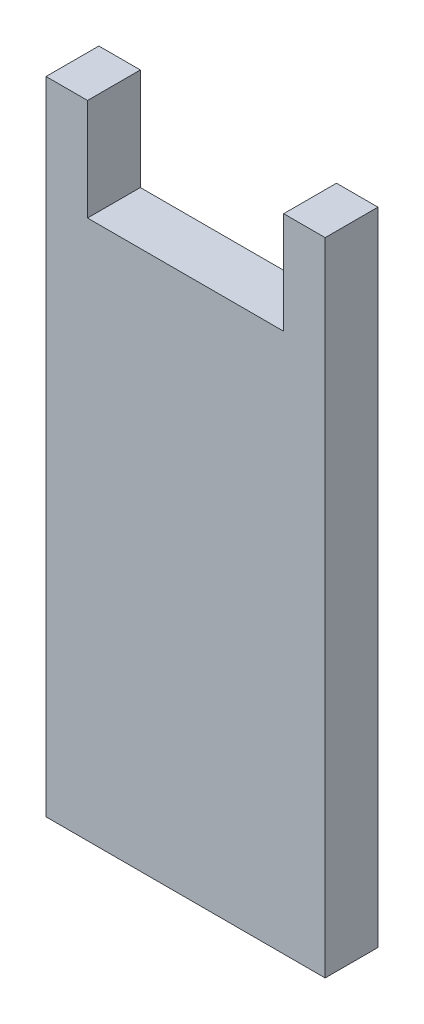
ISO-10303-21;
HEADER;
FILE_DESCRIPTION(('STEP AP214'),'2;1');
FILE_NAME('part.step','',(''),(''),'','','');
FILE_SCHEMA(('AUTOMOTIVE_DESIGN { 1 0 10303 214 1 1 1 1 }'));
ENDSEC;
DATA;
#1=APPLICATION_CONTEXT('core data for automotive mechanical design processes');
#2=APPLICATION_PROTOCOL_DEFINITION('international standard','automotive_design',2000,#1);
#3=PRODUCT_CONTEXT('',#1,'mechanical');
#4=PRODUCT('Part','Part','',(#3));
#5=PRODUCT_RELATED_PRODUCT_CATEGORY('part','',(#4));
#6=PRODUCT_DEFINITION_FORMATION('','',#4);
#7=PRODUCT_DEFINITION_CONTEXT('part definition',#1,'design');
#8=PRODUCT_DEFINITION('design','',#6,#7);
#9=PRODUCT_DEFINITION_SHAPE('','',#8);
#10=(LENGTH_UNIT() NAMED_UNIT(*) SI_UNIT(.MILLI.,.METRE.));
#11=(NAMED_UNIT(*) PLANE_ANGLE_UNIT() SI_UNIT($,.RADIAN.));
#12=(NAMED_UNIT(*) SI_UNIT($,.STERADIAN.) SOLID_ANGLE_UNIT());
#13=UNCERTAINTY_MEASURE_WITH_UNIT(LENGTH_MEASURE(1.E-05),#10,'distance_accuracy_value','');
#14=(GEOMETRIC_REPRESENTATION_CONTEXT(3) GLOBAL_UNCERTAINTY_ASSIGNED_CONTEXT((#13)) GLOBAL_UNIT_ASSIGNED_CONTEXT((#10,
#11,#12)) REPRESENTATION_CONTEXT('',''));
#15=CARTESIAN_POINT('',(0.,0.,0.));
#16=DIRECTION('',(0.,0.,1.));
#17=DIRECTION('',(1.,0.,0.));
#18=AXIS2_PLACEMENT_3D('',#15,#16,#17);
#19=CARTESIAN_POINT('',(20.,80.7608695652174,-7.));
#20=DIRECTION('',(1.,0.,0.));
#21=DIRECTION('',(0.,1.,0.));
#22=AXIS2_PLACEMENT_3D('',#19,#20,#21);
#23=PLANE('',#22);
#24=DIRECTION('',(0.,1.,0.));
#25=VECTOR('',#24,1.);
#26=CARTESIAN_POINT('',(20.,80.7608695652174,0.));
#27=LINE('',#26,#25);
#28=CARTESIAN_POINT('',(20.,-4.23913043478262,0.));
#29=VERTEX_POINT('',#28);
#30=CARTESIAN_POINT('',(20.,80.7608695652174,0.));
#31=VERTEX_POINT('',#30);
#32=EDGE_CURVE('E142',#29,#31,#27,.T.);
#33=ORIENTED_EDGE('',*,*,#32,.F.);
#34=DIRECTION('',(0.,0.,1.));
#35=VECTOR('',#34,1.);
#36=CARTESIAN_POINT('',(20.,-4.23913043478262,-7.));
#37=LINE('',#36,#35);
#38=CARTESIAN_POINT('',(20.,-4.23913043478262,-7.));
#39=VERTEX_POINT('',#38);
#40=EDGE_CURVE('E11',#39,#29,#37,.T.);
#41=ORIENTED_EDGE('',*,*,#40,.F.);
#42=DIRECTION('',(0.,1.,0.));
#43=VECTOR('',#42,1.);
#44=CARTESIAN_POINT('',(20.,80.7608695652174,-7.));
#45=LINE('',#44,#43);
#46=CARTESIAN_POINT('',(20.,80.7608695652174,-7.));
#47=VERTEX_POINT('',#46);
#48=EDGE_CURVE('E170',#39,#47,#45,.T.);
#49=ORIENTED_EDGE('',*,*,#48,.T.);
#50=DIRECTION('',(0.,0.,1.));
#51=VECTOR('',#50,1.);
#52=CARTESIAN_POINT('',(20.,80.7608695652174,-7.));
#53=LINE('',#52,#51);
#54=EDGE_CURVE('E42',#47,#31,#53,.T.);
#55=ORIENTED_EDGE('',*,*,#54,.T.);
#56=EDGE_LOOP('',(#33,#41,#49,#55));
#57=FACE_BOUND('',#56,.T.);
#58=ADVANCED_FACE('F39',(#57),#23,.T.);
#59=CARTESIAN_POINT('',(-17.,-4.23913043478262,-7.));
#60=DIRECTION('',(0.,-1.,0.));
#61=DIRECTION('',(0.,0.,-1.));
#62=AXIS2_PLACEMENT_3D('',#59,#60,#61);
#63=PLANE('',#62);
#64=DIRECTION('',(1.,0.,0.));
#65=VECTOR('',#64,1.);
#66=CARTESIAN_POINT('',(-17.,-4.23913043478262,0.));
#67=LINE('',#66,#65);
#68=CARTESIAN_POINT('',(-17.,-4.23913043478262,0.));
#69=VERTEX_POINT('',#68);
#70=EDGE_CURVE('E167',#69,#29,#67,.T.);
#71=ORIENTED_EDGE('',*,*,#70,.F.);
#72=DIRECTION('',(0.,0.,1.));
#73=VECTOR('',#72,1.);
#74=CARTESIAN_POINT('',(-17.,-4.23913043478262,-7.));
#75=LINE('',#74,#73);
#76=CARTESIAN_POINT('',(-17.,-4.23913043478262,-7.));
#77=VERTEX_POINT('',#76);
#78=EDGE_CURVE('E49',#77,#69,#75,.T.);
#79=ORIENTED_EDGE('',*,*,#78,.F.);
#80=DIRECTION('',(1.,0.,0.));
#81=VECTOR('',#80,1.);
#82=CARTESIAN_POINT('',(-17.,-4.23913043478262,-7.));
#83=LINE('',#82,#81);
#84=EDGE_CURVE('E128',#77,#39,#83,.T.);
#85=ORIENTED_EDGE('',*,*,#84,.T.);
#86=ORIENTED_EDGE('',*,*,#40,.T.);
#87=EDGE_LOOP('',(#71,#79,#85,#86));
#88=FACE_BOUND('',#87,.T.);
#89=ADVANCED_FACE('F188',(#88),#63,.T.);
#90=CARTESIAN_POINT('',(-17.,-4.23913043478262,-7.));
#91=DIRECTION('',(-1.,0.,0.));
#92=DIRECTION('',(0.,0.,1.));
#93=AXIS2_PLACEMENT_3D('',#90,#91,#92);
#94=PLANE('',#93);
#95=DIRECTION('',(0.,-1.,0.));
#96=VECTOR('',#95,1.);
#97=CARTESIAN_POINT('',(-17.,-4.23913043478262,0.));
#98=LINE('',#97,#96);
#99=CARTESIAN_POINT('',(-17.,80.7608695652174,0.));
#100=VERTEX_POINT('',#99);
#101=EDGE_CURVE('E114',#100,#69,#98,.T.);
#102=ORIENTED_EDGE('',*,*,#101,.F.);
#103=DIRECTION('',(0.,0.,1.));
#104=VECTOR('',#103,1.);
#105=CARTESIAN_POINT('',(-17.,80.7608695652174,-7.));
#106=LINE('',#105,#104);
#107=CARTESIAN_POINT('',(-17.,80.7608695652174,-7.));
#108=VERTEX_POINT('',#107);
#109=EDGE_CURVE('E109',#108,#100,#106,.T.);
#110=ORIENTED_EDGE('',*,*,#109,.F.);
#111=DIRECTION('',(0.,-1.,0.));
#112=VECTOR('',#111,1.);
#113=CARTESIAN_POINT('',(-17.,-4.23913043478262,-7.));
#114=LINE('',#113,#112);
#115=EDGE_CURVE('E112',#108,#77,#114,.T.);
#116=ORIENTED_EDGE('',*,*,#115,.T.);
#117=ORIENTED_EDGE('',*,*,#78,.T.);
#118=EDGE_LOOP('',(#102,#110,#116,#117));
#119=FACE_BOUND('',#118,.T.);
#120=ADVANCED_FACE('F111',(#119),#94,.T.);
#121=CARTESIAN_POINT('',(-17.,80.7608695652174,-7.));
#122=DIRECTION('',(0.,1.,0.));
#123=DIRECTION('',(0.,0.,1.));
#124=AXIS2_PLACEMENT_3D('',#121,#122,#123);
#125=PLANE('',#124);
#126=DIRECTION('',(-1.,0.,0.));
#127=VECTOR('',#126,1.);
#128=CARTESIAN_POINT('',(-17.,80.7608695652174,0.));
#129=LINE('',#128,#127);
#130=CARTESIAN_POINT('',(-11.5,80.7608695652174,0.));
#131=VERTEX_POINT('',#130);
#132=EDGE_CURVE('E162',#131,#100,#129,.T.);
#133=ORIENTED_EDGE('',*,*,#132,.F.);
#134=DIRECTION('',(0.,0.,1.));
#135=VECTOR('',#134,1.);
#136=CARTESIAN_POINT('',(-11.5,80.7608695652174,-7.));
#137=LINE('',#136,#135);
#138=CARTESIAN_POINT('',(-11.5,80.7608695652174,-7.));
#139=VERTEX_POINT('',#138);
#140=EDGE_CURVE('E120',#139,#131,#137,.T.);
#141=ORIENTED_EDGE('',*,*,#140,.F.);
#142=DIRECTION('',(-1.,0.,0.));
#143=VECTOR('',#142,1.);
#144=CARTESIAN_POINT('',(-17.,80.7608695652174,-7.));
#145=LINE('',#144,#143);
#146=EDGE_CURVE('E126',#139,#108,#145,.T.);
#147=ORIENTED_EDGE('',*,*,#146,.T.);
#148=ORIENTED_EDGE('',*,*,#109,.T.);
#149=EDGE_LOOP('',(#133,#141,#147,#148));
#150=FACE_BOUND('',#149,.T.);
#151=ADVANCED_FACE('F131',(#150),#125,.T.);
#152=CARTESIAN_POINT('',(-11.5,80.7608695652174,-7.));
#153=DIRECTION('',(1.,0.,0.));
#154=DIRECTION('',(0.,1.,0.));
#155=AXIS2_PLACEMENT_3D('',#152,#153,#154);
#156=PLANE('',#155);
#157=DIRECTION('',(0.,1.,0.));
#158=VECTOR('',#157,1.);
#159=CARTESIAN_POINT('',(-11.5,80.7608695652174,0.));
#160=LINE('',#159,#158);
#161=CARTESIAN_POINT('',(-11.5,67.2608695652174,0.));
#162=VERTEX_POINT('',#161);
#163=EDGE_CURVE('E158',#162,#131,#160,.T.);
#164=ORIENTED_EDGE('',*,*,#163,.F.);
#165=DIRECTION('',(0.,0.,1.));
#166=VECTOR('',#165,1.);
#167=CARTESIAN_POINT('',(-11.5,67.2608695652174,-7.));
#168=LINE('',#167,#166);
#169=CARTESIAN_POINT('',(-11.5,67.2608695652174,-7.));
#170=VERTEX_POINT('',#169);
#171=EDGE_CURVE('E176',#170,#162,#168,.T.);
#172=ORIENTED_EDGE('',*,*,#171,.F.);
#173=DIRECTION('',(0.,1.,0.));
#174=VECTOR('',#173,1.);
#175=CARTESIAN_POINT('',(-11.5,80.7608695652174,-7.));
#176=LINE('',#175,#174);
#177=EDGE_CURVE('E133',#170,#139,#176,.T.);
#178=ORIENTED_EDGE('',*,*,#177,.T.);
#179=ORIENTED_EDGE('',*,*,#140,.T.);
#180=EDGE_LOOP('',(#164,#172,#178,#179));
#181=FACE_BOUND('',#180,.T.);
#182=ADVANCED_FACE('F201',(#181),#156,.T.);
#183=CARTESIAN_POINT('',(-11.5,67.2608695652174,-7.));
#184=DIRECTION('',(0.,1.,0.));
#185=DIRECTION('',(0.,0.,1.));
#186=AXIS2_PLACEMENT_3D('',#183,#184,#185);
#187=PLANE('',#186);
#188=DIRECTION('',(-1.,0.,0.));
#189=VECTOR('',#188,1.);
#190=CARTESIAN_POINT('',(-11.5,67.2608695652174,0.));
#191=LINE('',#190,#189);
#192=CARTESIAN_POINT('',(14.5,67.2608695652174,0.));
#193=VERTEX_POINT('',#192);
#194=EDGE_CURVE('E154',#193,#162,#191,.T.);
#195=ORIENTED_EDGE('',*,*,#194,.F.);
#196=DIRECTION('',(0.,0.,1.));
#197=VECTOR('',#196,1.);
#198=CARTESIAN_POINT('',(14.5,67.2608695652174,-7.));
#199=LINE('',#198,#197);
#200=CARTESIAN_POINT('',(14.5,67.2608695652174,-7.));
#201=VERTEX_POINT('',#200);
#202=EDGE_CURVE('E179',#201,#193,#199,.T.);
#203=ORIENTED_EDGE('',*,*,#202,.F.);
#204=DIRECTION('',(-1.,0.,0.));
#205=VECTOR('',#204,1.);
#206=CARTESIAN_POINT('',(-11.5,67.2608695652174,-7.));
#207=LINE('',#206,#205);
#208=EDGE_CURVE('E136',#201,#170,#207,.T.);
#209=ORIENTED_EDGE('',*,*,#208,.T.);
#210=ORIENTED_EDGE('',*,*,#171,.T.);
#211=EDGE_LOOP('',(#195,#203,#209,#210));
#212=FACE_BOUND('',#211,.T.);
#213=ADVANCED_FACE('F204',(#212),#187,.T.);
#214=CARTESIAN_POINT('',(14.5,67.2608695652174,-7.));
#215=DIRECTION('',(-1.,0.,0.));
#216=DIRECTION('',(0.,-1.,0.));
#217=AXIS2_PLACEMENT_3D('',#214,#215,#216);
#218=PLANE('',#217);
#219=DIRECTION('',(0.,-1.,0.));
#220=VECTOR('',#219,1.);
#221=CARTESIAN_POINT('',(14.5,67.2608695652174,0.));
#222=LINE('',#221,#220);
#223=CARTESIAN_POINT('',(14.5,80.7608695652174,0.));
#224=VERTEX_POINT('',#223);
#225=EDGE_CURVE('E150',#224,#193,#222,.T.);
#226=ORIENTED_EDGE('',*,*,#225,.F.);
#227=DIRECTION('',(0.,0.,1.));
#228=VECTOR('',#227,1.);
#229=CARTESIAN_POINT('',(14.5,80.7608695652174,-7.));
#230=LINE('',#229,#228);
#231=CARTESIAN_POINT('',(14.5,80.7608695652174,-7.));
#232=VERTEX_POINT('',#231);
#233=EDGE_CURVE('E181',#232,#224,#230,.T.);
#234=ORIENTED_EDGE('',*,*,#233,.F.);
#235=DIRECTION('',(0.,-1.,0.));
#236=VECTOR('',#235,1.);
#237=CARTESIAN_POINT('',(14.5,67.2608695652174,-7.));
#238=LINE('',#237,#236);
#239=EDGE_CURVE('E279',#232,#201,#238,.T.);
#240=ORIENTED_EDGE('',*,*,#239,.T.);
#241=ORIENTED_EDGE('',*,*,#202,.T.);
#242=EDGE_LOOP('',(#226,#234,#240,#241));
#243=FACE_BOUND('',#242,.T.);
#244=ADVANCED_FACE('F208',(#243),#218,.T.);
#245=CARTESIAN_POINT('',(14.5,80.7608695652174,-7.));
#246=DIRECTION('',(0.,1.,0.));
#247=DIRECTION('',(0.,0.,1.));
#248=AXIS2_PLACEMENT_3D('',#245,#246,#247);
#249=PLANE('',#248);
#250=DIRECTION('',(-1.,0.,0.));
#251=VECTOR('',#250,1.);
#252=CARTESIAN_POINT('',(14.5,80.7608695652174,0.));
#253=LINE('',#252,#251);
#254=EDGE_CURVE('E146',#31,#224,#253,.T.);
#255=ORIENTED_EDGE('',*,*,#254,.F.);
#256=ORIENTED_EDGE('',*,*,#54,.F.);
#257=DIRECTION('',(-1.,0.,0.));
#258=VECTOR('',#257,1.);
#259=CARTESIAN_POINT('',(14.5,80.7608695652174,-7.));
#260=LINE('',#259,#258);
#261=EDGE_CURVE('E282',#47,#232,#260,.T.);
#262=ORIENTED_EDGE('',*,*,#261,.T.);
#263=ORIENTED_EDGE('',*,*,#233,.T.);
#264=EDGE_LOOP('',(#255,#256,#262,#263));
#265=FACE_BOUND('',#264,.T.);
#266=ADVANCED_FACE('F185',(#265),#249,.T.);
#267=CARTESIAN_POINT('',(0.,0.,-7.));
#268=DIRECTION('',(0.,0.,1.));
#269=DIRECTION('',(1.,0.,0.));
#270=AXIS2_PLACEMENT_3D('',#267,#268,#269);
#271=PLANE('',#270);
#272=ORIENTED_EDGE('',*,*,#48,.F.);
#273=ORIENTED_EDGE('',*,*,#84,.F.);
#274=ORIENTED_EDGE('',*,*,#115,.F.);
#275=ORIENTED_EDGE('',*,*,#146,.F.);
#276=ORIENTED_EDGE('',*,*,#177,.F.);
#277=ORIENTED_EDGE('',*,*,#208,.F.);
#278=ORIENTED_EDGE('',*,*,#239,.F.);
#279=ORIENTED_EDGE('',*,*,#261,.F.);
#280=EDGE_LOOP('',(#272,#273,#274,#275,#276,#277,#278,#279));
#281=FACE_BOUND('',#280,.T.);
#282=ADVANCED_FACE('F124',(#281),#271,.F.);
#283=CARTESIAN_POINT('',(0.,0.,0.));
#284=DIRECTION('',(0.,0.,1.));
#285=DIRECTION('',(1.,0.,0.));
#286=AXIS2_PLACEMENT_3D('',#283,#284,#285);
#287=PLANE('',#286);
#288=ORIENTED_EDGE('',*,*,#32,.T.);
#289=ORIENTED_EDGE('',*,*,#254,.T.);
#290=ORIENTED_EDGE('',*,*,#225,.T.);
#291=ORIENTED_EDGE('',*,*,#194,.T.);
#292=ORIENTED_EDGE('',*,*,#163,.T.);
#293=ORIENTED_EDGE('',*,*,#132,.T.);
#294=ORIENTED_EDGE('',*,*,#101,.T.);
#295=ORIENTED_EDGE('',*,*,#70,.T.);
#296=EDGE_LOOP('',(#288,#289,#290,#291,#292,#293,#294,#295));
#297=FACE_BOUND('',#296,.T.);
#298=ADVANCED_FACE('F187',(#297),#287,.T.);
#299=CLOSED_SHELL('',(#58,#89,#120,#151,#182,#213,#244,#266,#282,#298));
#300=MANIFOLD_SOLID_BREP('B2',#299);
#301=ADVANCED_BREP_SHAPE_REPRESENTATION('',(#18,#300),#14);
#302=SHAPE_DEFINITION_REPRESENTATION(#9,#301);
ENDSEC;
END-ISO-10303-21;
